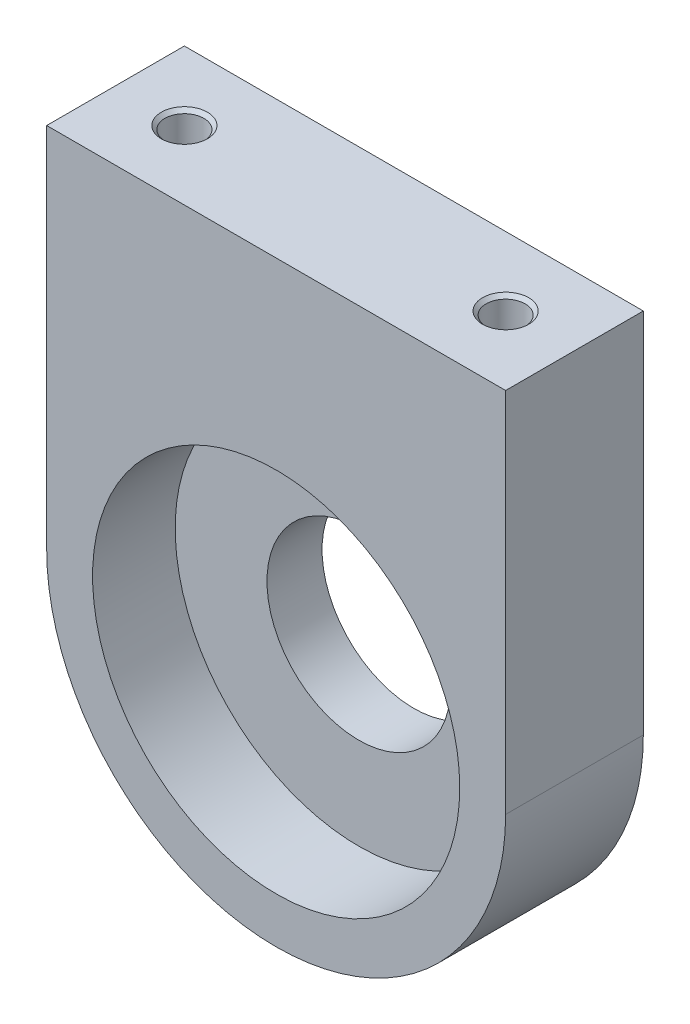
ISO-10303-21;
HEADER;
FILE_DESCRIPTION(('STEP AP214'),'2;1');
FILE_NAME('part.step','',(''),(''),'','','');
FILE_SCHEMA(('AUTOMOTIVE_DESIGN { 1 0 10303 214 1 1 1 1 }'));
ENDSEC;
DATA;
#1=APPLICATION_CONTEXT('core data for automotive mechanical design processes');
#2=APPLICATION_PROTOCOL_DEFINITION('international standard','automotive_design',2000,#1);
#3=PRODUCT_CONTEXT('',#1,'mechanical');
#4=PRODUCT('Part','Part','',(#3));
#5=PRODUCT_RELATED_PRODUCT_CATEGORY('part','',(#4));
#6=PRODUCT_DEFINITION_FORMATION('','',#4);
#7=PRODUCT_DEFINITION_CONTEXT('part definition',#1,'design');
#8=PRODUCT_DEFINITION('design','',#6,#7);
#9=PRODUCT_DEFINITION_SHAPE('','',#8);
#10=(LENGTH_UNIT() NAMED_UNIT(*) SI_UNIT(.MILLI.,.METRE.));
#11=(NAMED_UNIT(*) PLANE_ANGLE_UNIT() SI_UNIT($,.RADIAN.));
#12=(NAMED_UNIT(*) SI_UNIT($,.STERADIAN.) SOLID_ANGLE_UNIT());
#13=UNCERTAINTY_MEASURE_WITH_UNIT(LENGTH_MEASURE(1.E-05),#10,'distance_accuracy_value','');
#14=(GEOMETRIC_REPRESENTATION_CONTEXT(3) GLOBAL_UNCERTAINTY_ASSIGNED_CONTEXT((#13)) GLOBAL_UNIT_ASSIGNED_CONTEXT((#10,
#11,#12)) REPRESENTATION_CONTEXT('',''));
#15=CARTESIAN_POINT('',(0.,0.,0.));
#16=DIRECTION('',(0.,0.,1.));
#17=DIRECTION('',(1.,0.,0.));
#18=AXIS2_PLACEMENT_3D('',#15,#16,#17);
#19=CARTESIAN_POINT('',(0.,0.,-15.));
#20=DIRECTION('',(0.,0.,1.));
#21=DIRECTION('',(1.,0.,0.));
#22=AXIS2_PLACEMENT_3D('',#19,#20,#21);
#23=CYLINDRICAL_SURFACE('',#22,20.);
#24=CARTESIAN_POINT('',(0.,0.,-15.));
#25=DIRECTION('',(0.,0.,1.));
#26=DIRECTION('',(1.,0.,0.));
#27=AXIS2_PLACEMENT_3D('',#24,#25,#26);
#28=CIRCLE('',#27,20.);
#29=CARTESIAN_POINT('',(20.,0.,-15.));
#30=VERTEX_POINT('',#29);
#31=EDGE_CURVE('E124',#30,#30,#28,.T.);
#32=ORIENTED_EDGE('',*,*,#31,.F.);
#33=EDGE_LOOP('',(#32));
#34=FACE_BOUND('',#33,.T.);
#35=CARTESIAN_POINT('',(0.,0.,-3.));
#36=DIRECTION('',(0.,0.,1.));
#37=DIRECTION('',(1.,0.,0.));
#38=AXIS2_PLACEMENT_3D('',#35,#36,#37);
#39=CIRCLE('',#38,20.);
#40=CARTESIAN_POINT('',(20.,0.,-3.));
#41=VERTEX_POINT('',#40);
#42=EDGE_CURVE('E40',#41,#41,#39,.F.);
#43=ORIENTED_EDGE('',*,*,#42,.F.);
#44=EDGE_LOOP('',(#43));
#45=FACE_BOUND('',#44,.T.);
#46=ADVANCED_FACE('F36',(#34,#45),#23,.F.);
#47=CARTESIAN_POINT('',(0.,0.,15.));
#48=DIRECTION('',(0.,0.,-1.));
#49=DIRECTION('',(-1.,0.,0.));
#50=AXIS2_PLACEMENT_3D('',#47,#48,#49);
#51=CYLINDRICAL_SURFACE('',#50,50.);
#52=CARTESIAN_POINT('',(0.,0.,-15.));
#53=DIRECTION('',(0.,0.,1.));
#54=DIRECTION('',(1.,0.,0.));
#55=AXIS2_PLACEMENT_3D('',#52,#53,#54);
#56=CIRCLE('',#55,50.);
#57=CARTESIAN_POINT('',(-50.,0.,-15.));
#58=VERTEX_POINT('',#57);
#59=CARTESIAN_POINT('',(50.,0.,-15.));
#60=VERTEX_POINT('',#59);
#61=EDGE_CURVE('E127',#58,#60,#56,.T.);
#62=ORIENTED_EDGE('',*,*,#61,.T.);
#63=DIRECTION('',(0.,0.,-1.));
#64=VECTOR('',#63,1.);
#65=CARTESIAN_POINT('',(50.,0.,15.));
#66=LINE('',#65,#64);
#67=CARTESIAN_POINT('',(50.,0.,15.));
#68=VERTEX_POINT('',#67);
#69=EDGE_CURVE('E11',#68,#60,#66,.T.);
#70=ORIENTED_EDGE('',*,*,#69,.F.);
#71=CARTESIAN_POINT('',(0.,0.,15.));
#72=DIRECTION('',(0.,0.,1.));
#73=DIRECTION('',(1.,0.,0.));
#74=AXIS2_PLACEMENT_3D('',#71,#72,#73);
#75=CIRCLE('',#74,50.);
#76=CARTESIAN_POINT('',(-50.,0.,15.));
#77=VERTEX_POINT('',#76);
#78=EDGE_CURVE('E128',#77,#68,#75,.T.);
#79=ORIENTED_EDGE('',*,*,#78,.F.);
#80=DIRECTION('',(0.,0.,-1.));
#81=VECTOR('',#80,1.);
#82=CARTESIAN_POINT('',(-50.,0.,15.));
#83=LINE('',#82,#81);
#84=EDGE_CURVE('E134',#77,#58,#83,.T.);
#85=ORIENTED_EDGE('',*,*,#84,.T.);
#86=EDGE_LOOP('',(#62,#70,#79,#85));
#87=FACE_BOUND('',#86,.T.);
#88=ADVANCED_FACE('F38',(#87),#51,.T.);
#89=CARTESIAN_POINT('',(50.,80.,15.));
#90=DIRECTION('',(-1.,0.,0.));
#91=DIRECTION('',(0.,-1.,0.));
#92=AXIS2_PLACEMENT_3D('',#89,#90,#91);
#93=PLANE('',#92);
#94=DIRECTION('',(0.,1.,0.));
#95=VECTOR('',#94,1.);
#96=CARTESIAN_POINT('',(50.,80.,-15.));
#97=LINE('',#96,#95);
#98=CARTESIAN_POINT('',(50.,80.,-15.));
#99=VERTEX_POINT('',#98);
#100=EDGE_CURVE('E137',#60,#99,#97,.T.);
#101=ORIENTED_EDGE('',*,*,#100,.T.);
#102=DIRECTION('',(0.,0.,-1.));
#103=VECTOR('',#102,1.);
#104=CARTESIAN_POINT('',(50.,80.,15.));
#105=LINE('',#104,#103);
#106=CARTESIAN_POINT('',(50.,80.,15.));
#107=VERTEX_POINT('',#106);
#108=EDGE_CURVE('E46',#107,#99,#105,.T.);
#109=ORIENTED_EDGE('',*,*,#108,.F.);
#110=DIRECTION('',(0.,1.,0.));
#111=VECTOR('',#110,1.);
#112=CARTESIAN_POINT('',(50.,80.,15.));
#113=LINE('',#112,#111);
#114=EDGE_CURVE('E85',#68,#107,#113,.T.);
#115=ORIENTED_EDGE('',*,*,#114,.F.);
#116=ORIENTED_EDGE('',*,*,#69,.T.);
#117=EDGE_LOOP('',(#101,#109,#115,#116));
#118=FACE_BOUND('',#117,.T.);
#119=ADVANCED_FACE('F162',(#118),#93,.F.);
#120=CARTESIAN_POINT('',(-50.,80.,15.));
#121=DIRECTION('',(0.,-1.,0.));
#122=DIRECTION('',(0.,0.,-1.));
#123=AXIS2_PLACEMENT_3D('',#120,#121,#122);
#124=PLANE('',#123);
#125=CARTESIAN_POINT('',(-35.,80.,0.));
#126=DIRECTION('',(0.,1.,0.));
#127=DIRECTION('',(0.,0.,1.));
#128=AXIS2_PLACEMENT_3D('',#125,#126,#127);
#129=CIRCLE('',#128,5.025);
#130=CARTESIAN_POINT('',(-35.,80.,5.025));
#131=VERTEX_POINT('',#130);
#132=EDGE_CURVE('E109',#131,#131,#129,.T.);
#133=ORIENTED_EDGE('',*,*,#132,.F.);
#134=EDGE_LOOP('',(#133));
#135=FACE_BOUND('',#134,.T.);
#136=CARTESIAN_POINT('',(35.,80.,0.));
#137=DIRECTION('',(0.,1.,0.));
#138=DIRECTION('',(0.,0.,1.));
#139=AXIS2_PLACEMENT_3D('',#136,#137,#138);
#140=CIRCLE('',#139,5.025);
#141=CARTESIAN_POINT('',(35.,80.,5.025));
#142=VERTEX_POINT('',#141);
#143=EDGE_CURVE('E102',#142,#142,#140,.T.);
#144=ORIENTED_EDGE('',*,*,#143,.F.);
#145=EDGE_LOOP('',(#144));
#146=FACE_BOUND('',#145,.T.);
#147=DIRECTION('',(-1.,0.,0.));
#148=VECTOR('',#147,1.);
#149=CARTESIAN_POINT('',(-50.,80.,-15.));
#150=LINE('',#149,#148);
#151=CARTESIAN_POINT('',(-50.,80.,-15.));
#152=VERTEX_POINT('',#151);
#153=EDGE_CURVE('E72',#99,#152,#150,.T.);
#154=ORIENTED_EDGE('',*,*,#153,.T.);
#155=DIRECTION('',(0.,0.,-1.));
#156=VECTOR('',#155,1.);
#157=CARTESIAN_POINT('',(-50.,80.,15.));
#158=LINE('',#157,#156);
#159=CARTESIAN_POINT('',(-50.,80.,15.));
#160=VERTEX_POINT('',#159);
#161=EDGE_CURVE('E142',#160,#152,#158,.T.);
#162=ORIENTED_EDGE('',*,*,#161,.F.);
#163=DIRECTION('',(-1.,0.,0.));
#164=VECTOR('',#163,1.);
#165=CARTESIAN_POINT('',(-50.,80.,15.));
#166=LINE('',#165,#164);
#167=EDGE_CURVE('E131',#107,#160,#166,.T.);
#168=ORIENTED_EDGE('',*,*,#167,.F.);
#169=ORIENTED_EDGE('',*,*,#108,.T.);
#170=EDGE_LOOP('',(#154,#162,#168,#169));
#171=FACE_BOUND('',#170,.T.);
#172=ADVANCED_FACE('F145',(#135,#146,#171),#124,.F.);
#173=CARTESIAN_POINT('',(-50.,0.,15.));
#174=DIRECTION('',(1.,0.,0.));
#175=DIRECTION('',(0.,0.,-1.));
#176=AXIS2_PLACEMENT_3D('',#173,#174,#175);
#177=PLANE('',#176);
#178=DIRECTION('',(0.,-1.,0.));
#179=VECTOR('',#178,1.);
#180=CARTESIAN_POINT('',(-50.,0.,-15.));
#181=LINE('',#180,#179);
#182=EDGE_CURVE('E78',#152,#58,#181,.T.);
#183=ORIENTED_EDGE('',*,*,#182,.T.);
#184=ORIENTED_EDGE('',*,*,#84,.F.);
#185=DIRECTION('',(0.,-1.,0.));
#186=VECTOR('',#185,1.);
#187=CARTESIAN_POINT('',(-50.,0.,15.));
#188=LINE('',#187,#186);
#189=EDGE_CURVE('E54',#160,#77,#188,.T.);
#190=ORIENTED_EDGE('',*,*,#189,.F.);
#191=ORIENTED_EDGE('',*,*,#161,.T.);
#192=EDGE_LOOP('',(#183,#184,#190,#191));
#193=FACE_BOUND('',#192,.T.);
#194=ADVANCED_FACE('F152',(#193),#177,.F.);
#195=CARTESIAN_POINT('',(0.,0.,15.));
#196=DIRECTION('',(0.,0.,1.));
#197=DIRECTION('',(1.,0.,0.));
#198=AXIS2_PLACEMENT_3D('',#195,#196,#197);
#199=PLANE('',#198);
#200=CARTESIAN_POINT('',(0.,0.,15.));
#201=DIRECTION('',(0.,0.,1.));
#202=DIRECTION('',(1.,0.,0.));
#203=AXIS2_PLACEMENT_3D('',#200,#201,#202);
#204=CIRCLE('',#203,40.);
#205=CARTESIAN_POINT('',(40.,0.,15.));
#206=VERTEX_POINT('',#205);
#207=EDGE_CURVE('E118',#206,#206,#204,.T.);
#208=ORIENTED_EDGE('',*,*,#207,.F.);
#209=EDGE_LOOP('',(#208));
#210=FACE_BOUND('',#209,.T.);
#211=ORIENTED_EDGE('',*,*,#78,.T.);
#212=ORIENTED_EDGE('',*,*,#114,.T.);
#213=ORIENTED_EDGE('',*,*,#167,.T.);
#214=ORIENTED_EDGE('',*,*,#189,.T.);
#215=EDGE_LOOP('',(#211,#212,#213,#214));
#216=FACE_BOUND('',#215,.T.);
#217=ADVANCED_FACE('F154',(#210,#216),#199,.T.);
#218=CARTESIAN_POINT('',(0.,0.,-15.));
#219=DIRECTION('',(0.,0.,1.));
#220=DIRECTION('',(1.,0.,0.));
#221=AXIS2_PLACEMENT_3D('',#218,#219,#220);
#222=PLANE('',#221);
#223=ORIENTED_EDGE('',*,*,#31,.T.);
#224=EDGE_LOOP('',(#223));
#225=FACE_BOUND('',#224,.T.);
#226=ORIENTED_EDGE('',*,*,#61,.F.);
#227=ORIENTED_EDGE('',*,*,#182,.F.);
#228=ORIENTED_EDGE('',*,*,#153,.F.);
#229=ORIENTED_EDGE('',*,*,#100,.F.);
#230=EDGE_LOOP('',(#226,#227,#228,#229));
#231=FACE_BOUND('',#230,.T.);
#232=ADVANCED_FACE('F148',(#225,#231),#222,.F.);
#233=CARTESIAN_POINT('',(0.,0.,-3.));
#234=DIRECTION('',(0.,0.,1.));
#235=DIRECTION('',(1.,0.,0.));
#236=AXIS2_PLACEMENT_3D('',#233,#234,#235);
#237=PLANE('',#236);
#238=CARTESIAN_POINT('',(0.,0.,-3.));
#239=DIRECTION('',(0.,0.,1.));
#240=DIRECTION('',(1.,0.,0.));
#241=AXIS2_PLACEMENT_3D('',#238,#239,#240);
#242=CIRCLE('',#241,40.);
#243=CARTESIAN_POINT('',(40.,0.,-3.));
#244=VERTEX_POINT('',#243);
#245=EDGE_CURVE('E119',#244,#244,#242,.T.);
#246=ORIENTED_EDGE('',*,*,#245,.T.);
#247=EDGE_LOOP('',(#246));
#248=FACE_BOUND('',#247,.T.);
#249=ORIENTED_EDGE('',*,*,#42,.T.);
#250=EDGE_LOOP('',(#249));
#251=FACE_BOUND('',#250,.T.);
#252=ADVANCED_FACE('F178',(#248,#251),#237,.T.);
#253=CARTESIAN_POINT('',(0.,0.,-3.));
#254=DIRECTION('',(0.,0.,1.));
#255=DIRECTION('',(1.,0.,0.));
#256=AXIS2_PLACEMENT_3D('',#253,#254,#255);
#257=CYLINDRICAL_SURFACE('',#256,40.);
#258=ORIENTED_EDGE('',*,*,#245,.F.);
#259=EDGE_LOOP('',(#258));
#260=FACE_BOUND('',#259,.T.);
#261=ORIENTED_EDGE('',*,*,#207,.T.);
#262=EDGE_LOOP('',(#261));
#263=FACE_BOUND('',#262,.T.);
#264=ADVANCED_FACE('F175',(#260,#263),#257,.F.);
#265=CARTESIAN_POINT('',(35.,55.5,0.));
#266=DIRECTION('',(0.,1.,0.));
#267=DIRECTION('',(0.,0.,1.));
#268=AXIS2_PLACEMENT_3D('',#265,#266,#267);
#269=CONICAL_SURFACE('',#268,4.24999999999999,1.02974425867665);
#270=CARTESIAN_POINT('',(35.,52.9463423691329,0.));
#271=VERTEX_POINT('',#270);
#272=VERTEX_LOOP('',#271);
#273=FACE_BOUND('',#272,.T.);
#274=CARTESIAN_POINT('',(35.,55.5,0.));
#275=DIRECTION('',(0.,1.,0.));
#276=DIRECTION('',(0.,0.,1.));
#277=AXIS2_PLACEMENT_3D('',#274,#275,#276);
#278=CIRCLE('',#277,4.24999999999999);
#279=CARTESIAN_POINT('',(35.,55.5,4.24999999999999));
#280=VERTEX_POINT('',#279);
#281=EDGE_CURVE('E115',#280,#280,#278,.T.);
#282=ORIENTED_EDGE('',*,*,#281,.T.);
#283=EDGE_LOOP('',(#282));
#284=FACE_BOUND('',#283,.T.);
#285=ADVANCED_FACE('F187',(#273,#284),#269,.F.);
#286=CARTESIAN_POINT('',(35.,80.,0.));
#287=DIRECTION('',(0.,1.,0.));
#288=DIRECTION('',(0.,0.,1.));
#289=AXIS2_PLACEMENT_3D('',#286,#287,#288);
#290=CYLINDRICAL_SURFACE('',#289,4.24999999999999);
#291=ORIENTED_EDGE('',*,*,#281,.F.);
#292=EDGE_LOOP('',(#291));
#293=FACE_BOUND('',#292,.T.);
#294=CARTESIAN_POINT('',(35.,79.225,0.));
#295=DIRECTION('',(0.,1.,0.));
#296=DIRECTION('',(0.,0.,1.));
#297=AXIS2_PLACEMENT_3D('',#294,#295,#296);
#298=CIRCLE('',#297,4.25);
#299=CARTESIAN_POINT('',(35.,79.225,4.25));
#300=VERTEX_POINT('',#299);
#301=EDGE_CURVE('E106',#300,#300,#298,.T.);
#302=ORIENTED_EDGE('',*,*,#301,.T.);
#303=EDGE_LOOP('',(#302));
#304=FACE_BOUND('',#303,.T.);
#305=ADVANCED_FACE('F193',(#293,#304),#290,.F.);
#306=CARTESIAN_POINT('',(35.,80.,0.));
#307=DIRECTION('',(0.,1.,0.));
#308=DIRECTION('',(0.,0.,1.));
#309=AXIS2_PLACEMENT_3D('',#306,#307,#308);
#310=CONICAL_SURFACE('',#309,5.025,0.785398163397453);
#311=ORIENTED_EDGE('',*,*,#301,.F.);
#312=EDGE_LOOP('',(#311));
#313=FACE_BOUND('',#312,.T.);
#314=ORIENTED_EDGE('',*,*,#143,.T.);
#315=EDGE_LOOP('',(#314));
#316=FACE_BOUND('',#315,.T.);
#317=ADVANCED_FACE('F96',(#313,#316),#310,.F.);
#318=CARTESIAN_POINT('',(-35.,55.5,0.));
#319=DIRECTION('',(0.,1.,0.));
#320=DIRECTION('',(0.,0.,1.));
#321=AXIS2_PLACEMENT_3D('',#318,#319,#320);
#322=CONICAL_SURFACE('',#321,4.24999999999999,1.02974425867665);
#323=CARTESIAN_POINT('',(-35.,52.9463423691329,0.));
#324=VERTEX_POINT('',#323);
#325=VERTEX_LOOP('',#324);
#326=FACE_BOUND('',#325,.T.);
#327=CARTESIAN_POINT('',(-35.,55.5,0.));
#328=DIRECTION('',(0.,1.,0.));
#329=DIRECTION('',(0.,0.,1.));
#330=AXIS2_PLACEMENT_3D('',#327,#328,#329);
#331=CIRCLE('',#330,4.24999999999999);
#332=CARTESIAN_POINT('',(-35.,55.5,4.24999999999999));
#333=VERTEX_POINT('',#332);
#334=EDGE_CURVE('E100',#333,#333,#331,.T.);
#335=ORIENTED_EDGE('',*,*,#334,.T.);
#336=EDGE_LOOP('',(#335));
#337=FACE_BOUND('',#336,.T.);
#338=ADVANCED_FACE('F92',(#326,#337),#322,.F.);
#339=CARTESIAN_POINT('',(-35.,80.,0.));
#340=DIRECTION('',(0.,1.,0.));
#341=DIRECTION('',(0.,0.,1.));
#342=AXIS2_PLACEMENT_3D('',#339,#340,#341);
#343=CYLINDRICAL_SURFACE('',#342,4.24999999999999);
#344=ORIENTED_EDGE('',*,*,#334,.F.);
#345=EDGE_LOOP('',(#344));
#346=FACE_BOUND('',#345,.T.);
#347=CARTESIAN_POINT('',(-35.,79.225,0.));
#348=DIRECTION('',(0.,1.,0.));
#349=DIRECTION('',(0.,0.,1.));
#350=AXIS2_PLACEMENT_3D('',#347,#348,#349);
#351=CIRCLE('',#350,4.25);
#352=CARTESIAN_POINT('',(-35.,79.225,4.25));
#353=VERTEX_POINT('',#352);
#354=EDGE_CURVE('E103',#353,#353,#351,.T.);
#355=ORIENTED_EDGE('',*,*,#354,.T.);
#356=EDGE_LOOP('',(#355));
#357=FACE_BOUND('',#356,.T.);
#358=ADVANCED_FACE('F95',(#346,#357),#343,.F.);
#359=CARTESIAN_POINT('',(-35.,80.,0.));
#360=DIRECTION('',(0.,1.,0.));
#361=DIRECTION('',(0.,0.,1.));
#362=AXIS2_PLACEMENT_3D('',#359,#360,#361);
#363=CONICAL_SURFACE('',#362,5.025,0.785398163397453);
#364=ORIENTED_EDGE('',*,*,#354,.F.);
#365=EDGE_LOOP('',(#364));
#366=FACE_BOUND('',#365,.T.);
#367=ORIENTED_EDGE('',*,*,#132,.T.);
#368=EDGE_LOOP('',(#367));
#369=FACE_BOUND('',#368,.T.);
#370=ADVANCED_FACE('F203',(#366,#369),#363,.F.);
#371=CLOSED_SHELL('',(#46,#88,#119,#172,#194,#217,#232,#252,#264,#285,#305,#317,#338,#358,#370));
#372=MANIFOLD_SOLID_BREP('B2',#371);
#373=ADVANCED_BREP_SHAPE_REPRESENTATION('',(#18,#372),#14);
#374=SHAPE_DEFINITION_REPRESENTATION(#9,#373);
ENDSEC;
END-ISO-10303-21;
